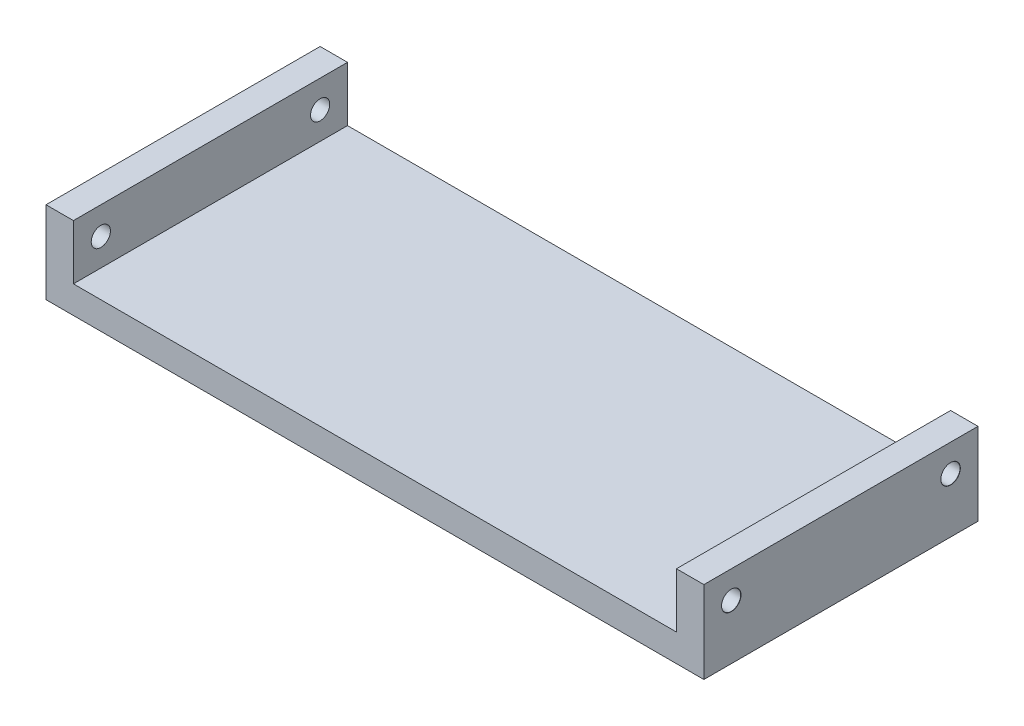
ISO-10303-21;
HEADER;
FILE_DESCRIPTION(('STEP AP214'),'2;1');
FILE_NAME('part.step','',(''),(''),'','','');
FILE_SCHEMA(('AUTOMOTIVE_DESIGN { 1 0 10303 214 1 1 1 1 }'));
ENDSEC;
DATA;
#1=APPLICATION_CONTEXT('core data for automotive mechanical design processes');
#2=APPLICATION_PROTOCOL_DEFINITION('international standard','automotive_design',2000,#1);
#3=PRODUCT_CONTEXT('',#1,'mechanical');
#4=PRODUCT('Part','Part','',(#3));
#5=PRODUCT_RELATED_PRODUCT_CATEGORY('part','',(#4));
#6=PRODUCT_DEFINITION_FORMATION('','',#4);
#7=PRODUCT_DEFINITION_CONTEXT('part definition',#1,'design');
#8=PRODUCT_DEFINITION('design','',#6,#7);
#9=PRODUCT_DEFINITION_SHAPE('','',#8);
#10=(LENGTH_UNIT() NAMED_UNIT(*) SI_UNIT(.MILLI.,.METRE.));
#11=(NAMED_UNIT(*) PLANE_ANGLE_UNIT() SI_UNIT($,.RADIAN.));
#12=(NAMED_UNIT(*) SI_UNIT($,.STERADIAN.) SOLID_ANGLE_UNIT());
#13=UNCERTAINTY_MEASURE_WITH_UNIT(LENGTH_MEASURE(1.E-05),#10,'distance_accuracy_value','');
#14=(GEOMETRIC_REPRESENTATION_CONTEXT(3) GLOBAL_UNCERTAINTY_ASSIGNED_CONTEXT((#13)) GLOBAL_UNIT_ASSIGNED_CONTEXT((#10,
#11,#12)) REPRESENTATION_CONTEXT('',''));
#15=CARTESIAN_POINT('',(0.,0.,0.));
#16=DIRECTION('',(0.,0.,1.));
#17=DIRECTION('',(1.,0.,0.));
#18=AXIS2_PLACEMENT_3D('',#15,#16,#17);
#19=CARTESIAN_POINT('',(-60.,5.,25.));
#20=DIRECTION('',(1.,0.,0.));
#21=DIRECTION('',(0.,0.,-1.));
#22=AXIS2_PLACEMENT_3D('',#19,#20,#21);
#23=PLANE('',#22);
#24=CARTESIAN_POINT('',(-60.,10.,20.));
#25=DIRECTION('',(1.,0.,0.));
#26=DIRECTION('',(0.,0.,-1.));
#27=AXIS2_PLACEMENT_3D('',#24,#25,#26);
#28=CIRCLE('',#27,1.74999999999999);
#29=CARTESIAN_POINT('',(-60.,10.,18.25));
#30=VERTEX_POINT('',#29);
#31=EDGE_CURVE('E225',#30,#30,#28,.T.);
#32=ORIENTED_EDGE('',*,*,#31,.T.);
#33=EDGE_LOOP('',(#32));
#34=FACE_BOUND('',#33,.T.);
#35=CARTESIAN_POINT('',(-60.,10.,-20.));
#36=DIRECTION('',(1.,0.,0.));
#37=DIRECTION('',(0.,0.,-1.));
#38=AXIS2_PLACEMENT_3D('',#35,#36,#37);
#39=CIRCLE('',#38,1.74999999999999);
#40=CARTESIAN_POINT('',(-60.,10.,-21.75));
#41=VERTEX_POINT('',#40);
#42=EDGE_CURVE('E203',#41,#41,#39,.T.);
#43=ORIENTED_EDGE('',*,*,#42,.T.);
#44=EDGE_LOOP('',(#43));
#45=FACE_BOUND('',#44,.T.);
#46=DIRECTION('',(0.,0.,1.));
#47=VECTOR('',#46,1.);
#48=CARTESIAN_POINT('',(-60.,0.,25.));
#49=LINE('',#48,#47);
#50=CARTESIAN_POINT('',(-60.,0.,-25.));
#51=VERTEX_POINT('',#50);
#52=CARTESIAN_POINT('',(-60.,0.,25.));
#53=VERTEX_POINT('',#52);
#54=EDGE_CURVE('E116',#51,#53,#49,.T.);
#55=ORIENTED_EDGE('',*,*,#54,.T.);
#56=DIRECTION('',(0.,-1.,0.));
#57=VECTOR('',#56,1.);
#58=CARTESIAN_POINT('',(-60.,5.,25.));
#59=LINE('',#58,#57);
#60=CARTESIAN_POINT('',(-60.,15.,25.));
#61=VERTEX_POINT('',#60);
#62=EDGE_CURVE('E11',#61,#53,#59,.T.);
#63=ORIENTED_EDGE('',*,*,#62,.F.);
#64=DIRECTION('',(0.,0.,1.));
#65=VECTOR('',#64,1.);
#66=CARTESIAN_POINT('',(-60.,15.,-25.));
#67=LINE('',#66,#65);
#68=CARTESIAN_POINT('',(-60.,15.,-25.));
#69=VERTEX_POINT('',#68);
#70=EDGE_CURVE('E114',#69,#61,#67,.T.);
#71=ORIENTED_EDGE('',*,*,#70,.F.);
#72=DIRECTION('',(0.,-1.,0.));
#73=VECTOR('',#72,1.);
#74=CARTESIAN_POINT('',(-60.,5.,-25.));
#75=LINE('',#74,#73);
#76=EDGE_CURVE('E181',#69,#51,#75,.T.);
#77=ORIENTED_EDGE('',*,*,#76,.T.);
#78=EDGE_LOOP('',(#55,#63,#71,#77));
#79=FACE_BOUND('',#78,.T.);
#80=ADVANCED_FACE('F45',(#34,#45,#79),#23,.F.);
#81=CARTESIAN_POINT('',(60.,5.,25.));
#82=DIRECTION('',(0.,0.,-1.));
#83=DIRECTION('',(-1.,0.,0.));
#84=AXIS2_PLACEMENT_3D('',#81,#82,#83);
#85=PLANE('',#84);
#86=DIRECTION('',(1.,0.,0.));
#87=VECTOR('',#86,1.);
#88=CARTESIAN_POINT('',(60.,0.,25.));
#89=LINE('',#88,#87);
#90=CARTESIAN_POINT('',(60.,0.,25.));
#91=VERTEX_POINT('',#90);
#92=EDGE_CURVE('E184',#53,#91,#89,.T.);
#93=ORIENTED_EDGE('',*,*,#92,.T.);
#94=DIRECTION('',(0.,-1.,0.));
#95=VECTOR('',#94,1.);
#96=CARTESIAN_POINT('',(60.,5.,25.));
#97=LINE('',#96,#95);
#98=CARTESIAN_POINT('',(60.,15.,25.));
#99=VERTEX_POINT('',#98);
#100=EDGE_CURVE('E54',#99,#91,#97,.T.);
#101=ORIENTED_EDGE('',*,*,#100,.F.);
#102=DIRECTION('',(1.,0.,0.));
#103=VECTOR('',#102,1.);
#104=CARTESIAN_POINT('',(60.,15.,25.));
#105=LINE('',#104,#103);
#106=CARTESIAN_POINT('',(55.,15.,25.));
#107=VERTEX_POINT('',#106);
#108=EDGE_CURVE('E158',#107,#99,#105,.T.);
#109=ORIENTED_EDGE('',*,*,#108,.F.);
#110=DIRECTION('',(0.,-1.,0.));
#111=VECTOR('',#110,1.);
#112=CARTESIAN_POINT('',(55.,15.,25.));
#113=LINE('',#112,#111);
#114=CARTESIAN_POINT('',(55.,5.,25.));
#115=VERTEX_POINT('',#114);
#116=EDGE_CURVE('E154',#107,#115,#113,.T.);
#117=ORIENTED_EDGE('',*,*,#116,.T.);
#118=DIRECTION('',(1.,0.,0.));
#119=VECTOR('',#118,1.);
#120=CARTESIAN_POINT('',(60.,5.,25.));
#121=LINE('',#120,#119);
#122=CARTESIAN_POINT('',(-55.,5.,25.));
#123=VERTEX_POINT('',#122);
#124=EDGE_CURVE('E174',#123,#115,#121,.T.);
#125=ORIENTED_EDGE('',*,*,#124,.F.);
#126=DIRECTION('',(0.,-1.,0.));
#127=VECTOR('',#126,1.);
#128=CARTESIAN_POINT('',(-55.,15.,25.));
#129=LINE('',#128,#127);
#130=CARTESIAN_POINT('',(-55.,15.,25.));
#131=VERTEX_POINT('',#130);
#132=EDGE_CURVE('E122',#131,#123,#129,.T.);
#133=ORIENTED_EDGE('',*,*,#132,.F.);
#134=DIRECTION('',(1.,0.,0.));
#135=VECTOR('',#134,1.);
#136=CARTESIAN_POINT('',(-60.,15.,25.));
#137=LINE('',#136,#135);
#138=EDGE_CURVE('E119',#61,#131,#137,.T.);
#139=ORIENTED_EDGE('',*,*,#138,.F.);
#140=ORIENTED_EDGE('',*,*,#62,.T.);
#141=EDGE_LOOP('',(#93,#101,#109,#117,#125,#133,#139,#140));
#142=FACE_BOUND('',#141,.T.);
#143=ADVANCED_FACE('F120',(#142),#85,.F.);
#144=CARTESIAN_POINT('',(60.,5.,25.));
#145=DIRECTION('',(-1.,0.,0.));
#146=DIRECTION('',(0.,0.,1.));
#147=AXIS2_PLACEMENT_3D('',#144,#145,#146);
#148=PLANE('',#147);
#149=CARTESIAN_POINT('',(60.,10.,20.));
#150=DIRECTION('',(1.,0.,0.));
#151=DIRECTION('',(0.,0.,-1.));
#152=AXIS2_PLACEMENT_3D('',#149,#150,#151);
#153=CIRCLE('',#152,1.775);
#154=CARTESIAN_POINT('',(60.,10.,18.225));
#155=VERTEX_POINT('',#154);
#156=EDGE_CURVE('E233',#155,#155,#153,.T.);
#157=ORIENTED_EDGE('',*,*,#156,.F.);
#158=EDGE_LOOP('',(#157));
#159=FACE_BOUND('',#158,.T.);
#160=CARTESIAN_POINT('',(60.,10.,-20.));
#161=DIRECTION('',(1.,0.,0.));
#162=DIRECTION('',(0.,0.,-1.));
#163=AXIS2_PLACEMENT_3D('',#160,#161,#162);
#164=CIRCLE('',#163,1.775);
#165=CARTESIAN_POINT('',(60.,10.,-21.775));
#166=VERTEX_POINT('',#165);
#167=EDGE_CURVE('E215',#166,#166,#164,.T.);
#168=ORIENTED_EDGE('',*,*,#167,.F.);
#169=EDGE_LOOP('',(#168));
#170=FACE_BOUND('',#169,.T.);
#171=DIRECTION('',(0.,0.,-1.));
#172=VECTOR('',#171,1.);
#173=CARTESIAN_POINT('',(60.,0.,25.));
#174=LINE('',#173,#172);
#175=CARTESIAN_POINT('',(60.,0.,-25.));
#176=VERTEX_POINT('',#175);
#177=EDGE_CURVE('E187',#91,#176,#174,.T.);
#178=ORIENTED_EDGE('',*,*,#177,.T.);
#179=DIRECTION('',(0.,-1.,0.));
#180=VECTOR('',#179,1.);
#181=CARTESIAN_POINT('',(60.,5.,-25.));
#182=LINE('',#181,#180);
#183=CARTESIAN_POINT('',(60.,15.,-25.));
#184=VERTEX_POINT('',#183);
#185=EDGE_CURVE('E194',#184,#176,#182,.T.);
#186=ORIENTED_EDGE('',*,*,#185,.F.);
#187=DIRECTION('',(0.,0.,-1.));
#188=VECTOR('',#187,1.);
#189=CARTESIAN_POINT('',(60.,15.,-25.));
#190=LINE('',#189,#188);
#191=EDGE_CURVE('E161',#99,#184,#190,.T.);
#192=ORIENTED_EDGE('',*,*,#191,.F.);
#193=ORIENTED_EDGE('',*,*,#100,.T.);
#194=EDGE_LOOP('',(#178,#186,#192,#193));
#195=FACE_BOUND('',#194,.T.);
#196=ADVANCED_FACE('F240',(#159,#170,#195),#148,.F.);
#197=CARTESIAN_POINT('',(60.,5.,-25.));
#198=DIRECTION('',(0.,0.,1.));
#199=DIRECTION('',(1.,0.,0.));
#200=AXIS2_PLACEMENT_3D('',#197,#198,#199);
#201=PLANE('',#200);
#202=DIRECTION('',(-1.,0.,0.));
#203=VECTOR('',#202,1.);
#204=CARTESIAN_POINT('',(60.,0.,-25.));
#205=LINE('',#204,#203);
#206=EDGE_CURVE('E178',#176,#51,#205,.T.);
#207=ORIENTED_EDGE('',*,*,#206,.T.);
#208=ORIENTED_EDGE('',*,*,#76,.F.);
#209=DIRECTION('',(-1.,0.,0.));
#210=VECTOR('',#209,1.);
#211=CARTESIAN_POINT('',(-60.,15.,-25.));
#212=LINE('',#211,#210);
#213=CARTESIAN_POINT('',(-55.,15.,-25.));
#214=VERTEX_POINT('',#213);
#215=EDGE_CURVE('E131',#214,#69,#212,.T.);
#216=ORIENTED_EDGE('',*,*,#215,.F.);
#217=DIRECTION('',(0.,-1.,0.));
#218=VECTOR('',#217,1.);
#219=CARTESIAN_POINT('',(-55.,15.,-25.));
#220=LINE('',#219,#218);
#221=CARTESIAN_POINT('',(-55.,5.,-25.));
#222=VERTEX_POINT('',#221);
#223=EDGE_CURVE('E143',#214,#222,#220,.T.);
#224=ORIENTED_EDGE('',*,*,#223,.T.);
#225=DIRECTION('',(-1.,0.,0.));
#226=VECTOR('',#225,1.);
#227=CARTESIAN_POINT('',(60.,5.,-25.));
#228=LINE('',#227,#226);
#229=CARTESIAN_POINT('',(55.,5.,-25.));
#230=VERTEX_POINT('',#229);
#231=EDGE_CURVE('E177',#230,#222,#228,.T.);
#232=ORIENTED_EDGE('',*,*,#231,.F.);
#233=DIRECTION('',(0.,-1.,0.));
#234=VECTOR('',#233,1.);
#235=CARTESIAN_POINT('',(55.,15.,-25.));
#236=LINE('',#235,#234);
#237=CARTESIAN_POINT('',(55.,15.,-25.));
#238=VERTEX_POINT('',#237);
#239=EDGE_CURVE('E150',#238,#230,#236,.T.);
#240=ORIENTED_EDGE('',*,*,#239,.F.);
#241=DIRECTION('',(-1.,0.,0.));
#242=VECTOR('',#241,1.);
#243=CARTESIAN_POINT('',(60.,15.,-25.));
#244=LINE('',#243,#242);
#245=EDGE_CURVE('E168',#184,#238,#244,.T.);
#246=ORIENTED_EDGE('',*,*,#245,.F.);
#247=ORIENTED_EDGE('',*,*,#185,.T.);
#248=EDGE_LOOP('',(#207,#208,#216,#224,#232,#240,#246,#247));
#249=FACE_BOUND('',#248,.T.);
#250=ADVANCED_FACE('F243',(#249),#201,.F.);
#251=CARTESIAN_POINT('',(0.,5.,0.));
#252=DIRECTION('',(0.,1.,0.));
#253=DIRECTION('',(0.,0.,1.));
#254=AXIS2_PLACEMENT_3D('',#251,#252,#253);
#255=PLANE('',#254);
#256=DIRECTION('',(0.,0.,-1.));
#257=VECTOR('',#256,1.);
#258=CARTESIAN_POINT('',(-55.,5.,-25.));
#259=LINE('',#258,#257);
#260=EDGE_CURVE('E67',#123,#222,#259,.T.);
#261=ORIENTED_EDGE('',*,*,#260,.F.);
#262=ORIENTED_EDGE('',*,*,#124,.T.);
#263=DIRECTION('',(0.,0.,1.));
#264=VECTOR('',#263,1.);
#265=CARTESIAN_POINT('',(55.,5.,-25.));
#266=LINE('',#265,#264);
#267=EDGE_CURVE('E62',#230,#115,#266,.T.);
#268=ORIENTED_EDGE('',*,*,#267,.F.);
#269=ORIENTED_EDGE('',*,*,#231,.T.);
#270=EDGE_LOOP('',(#261,#262,#268,#269));
#271=FACE_BOUND('',#270,.T.);
#272=ADVANCED_FACE('F265',(#271),#255,.T.);
#273=CARTESIAN_POINT('',(0.,0.,0.));
#274=DIRECTION('',(0.,1.,0.));
#275=DIRECTION('',(0.,0.,1.));
#276=AXIS2_PLACEMENT_3D('',#273,#274,#275);
#277=PLANE('',#276);
#278=ORIENTED_EDGE('',*,*,#54,.F.);
#279=ORIENTED_EDGE('',*,*,#206,.F.);
#280=ORIENTED_EDGE('',*,*,#177,.F.);
#281=ORIENTED_EDGE('',*,*,#92,.F.);
#282=EDGE_LOOP('',(#278,#279,#280,#281));
#283=FACE_BOUND('',#282,.T.);
#284=ADVANCED_FACE('F254',(#283),#277,.F.);
#285=CARTESIAN_POINT('',(55.,15.,-25.));
#286=DIRECTION('',(1.,0.,0.));
#287=DIRECTION('',(0.,0.,-1.));
#288=AXIS2_PLACEMENT_3D('',#285,#286,#287);
#289=PLANE('',#288);
#290=CARTESIAN_POINT('',(55.,10.,20.));
#291=DIRECTION('',(1.,0.,0.));
#292=DIRECTION('',(0.,0.,-1.));
#293=AXIS2_PLACEMENT_3D('',#290,#291,#292);
#294=CIRCLE('',#293,1.74999999999999);
#295=CARTESIAN_POINT('',(55.,10.,18.25));
#296=VERTEX_POINT('',#295);
#297=EDGE_CURVE('E221',#296,#296,#294,.T.);
#298=ORIENTED_EDGE('',*,*,#297,.T.);
#299=EDGE_LOOP('',(#298));
#300=FACE_BOUND('',#299,.T.);
#301=CARTESIAN_POINT('',(55.,10.,-20.));
#302=DIRECTION('',(1.,0.,0.));
#303=DIRECTION('',(0.,0.,-1.));
#304=AXIS2_PLACEMENT_3D('',#301,#302,#303);
#305=CIRCLE('',#304,1.74999999999999);
#306=CARTESIAN_POINT('',(55.,10.,-21.75));
#307=VERTEX_POINT('',#306);
#308=EDGE_CURVE('E137',#307,#307,#305,.T.);
#309=ORIENTED_EDGE('',*,*,#308,.T.);
#310=EDGE_LOOP('',(#309));
#311=FACE_BOUND('',#310,.T.);
#312=ORIENTED_EDGE('',*,*,#267,.T.);
#313=ORIENTED_EDGE('',*,*,#116,.F.);
#314=DIRECTION('',(0.,0.,1.));
#315=VECTOR('',#314,1.);
#316=CARTESIAN_POINT('',(55.,15.,-25.));
#317=LINE('',#316,#315);
#318=EDGE_CURVE('E165',#238,#107,#317,.T.);
#319=ORIENTED_EDGE('',*,*,#318,.F.);
#320=ORIENTED_EDGE('',*,*,#239,.T.);
#321=EDGE_LOOP('',(#312,#313,#319,#320));
#322=FACE_BOUND('',#321,.T.);
#323=ADVANCED_FACE('F261',(#300,#311,#322),#289,.F.);
#324=CARTESIAN_POINT('',(0.,15.,0.));
#325=DIRECTION('',(0.,-1.,0.));
#326=DIRECTION('',(0.,0.,-1.));
#327=AXIS2_PLACEMENT_3D('',#324,#325,#326);
#328=PLANE('',#327);
#329=ORIENTED_EDGE('',*,*,#191,.T.);
#330=ORIENTED_EDGE('',*,*,#245,.T.);
#331=ORIENTED_EDGE('',*,*,#318,.T.);
#332=ORIENTED_EDGE('',*,*,#108,.T.);
#333=EDGE_LOOP('',(#329,#330,#331,#332));
#334=FACE_BOUND('',#333,.T.);
#335=ADVANCED_FACE('F257',(#334),#328,.F.);
#336=CARTESIAN_POINT('',(-55.,15.,-25.));
#337=DIRECTION('',(-1.,0.,0.));
#338=DIRECTION('',(0.,0.,1.));
#339=AXIS2_PLACEMENT_3D('',#336,#337,#338);
#340=PLANE('',#339);
#341=CARTESIAN_POINT('',(-55.,10.,20.));
#342=DIRECTION('',(-1.,0.,0.));
#343=DIRECTION('',(0.,0.,1.));
#344=AXIS2_PLACEMENT_3D('',#341,#342,#343);
#345=CIRCLE('',#344,1.74999999999999);
#346=CARTESIAN_POINT('',(-55.,10.,21.75));
#347=VERTEX_POINT('',#346);
#348=EDGE_CURVE('E48',#347,#347,#345,.T.);
#349=ORIENTED_EDGE('',*,*,#348,.T.);
#350=EDGE_LOOP('',(#349));
#351=FACE_BOUND('',#350,.T.);
#352=CARTESIAN_POINT('',(-55.,10.,-20.));
#353=DIRECTION('',(-1.,0.,0.));
#354=DIRECTION('',(0.,0.,1.));
#355=AXIS2_PLACEMENT_3D('',#352,#353,#354);
#356=CIRCLE('',#355,1.74999999999999);
#357=CARTESIAN_POINT('',(-55.,10.,-18.25));
#358=VERTEX_POINT('',#357);
#359=EDGE_CURVE('E200',#358,#358,#356,.T.);
#360=ORIENTED_EDGE('',*,*,#359,.T.);
#361=EDGE_LOOP('',(#360));
#362=FACE_BOUND('',#361,.T.);
#363=ORIENTED_EDGE('',*,*,#260,.T.);
#364=ORIENTED_EDGE('',*,*,#223,.F.);
#365=DIRECTION('',(0.,0.,-1.));
#366=VECTOR('',#365,1.);
#367=CARTESIAN_POINT('',(-55.,15.,-25.));
#368=LINE('',#367,#366);
#369=EDGE_CURVE('E126',#131,#214,#368,.T.);
#370=ORIENTED_EDGE('',*,*,#369,.F.);
#371=ORIENTED_EDGE('',*,*,#132,.T.);
#372=EDGE_LOOP('',(#363,#364,#370,#371));
#373=FACE_BOUND('',#372,.T.);
#374=ADVANCED_FACE('F263',(#351,#362,#373),#340,.F.);
#375=CARTESIAN_POINT('',(0.,15.,0.));
#376=DIRECTION('',(0.,1.,0.));
#377=DIRECTION('',(0.,0.,1.));
#378=AXIS2_PLACEMENT_3D('',#375,#376,#377);
#379=PLANE('',#378);
#380=ORIENTED_EDGE('',*,*,#70,.T.);
#381=ORIENTED_EDGE('',*,*,#138,.T.);
#382=ORIENTED_EDGE('',*,*,#369,.T.);
#383=ORIENTED_EDGE('',*,*,#215,.T.);
#384=EDGE_LOOP('',(#380,#381,#382,#383));
#385=FACE_BOUND('',#384,.T.);
#386=ADVANCED_FACE('F129',(#385),#379,.T.);
#387=CARTESIAN_POINT('',(60.,10.,-20.));
#388=DIRECTION('',(1.,0.,0.));
#389=DIRECTION('',(0.,0.,-1.));
#390=AXIS2_PLACEMENT_3D('',#387,#388,#389);
#391=CYLINDRICAL_SURFACE('',#390,1.74999999999999);
#392=ORIENTED_EDGE('',*,*,#42,.F.);
#393=EDGE_LOOP('',(#392));
#394=FACE_BOUND('',#393,.T.);
#395=ORIENTED_EDGE('',*,*,#359,.F.);
#396=EDGE_LOOP('',(#395));
#397=FACE_BOUND('',#396,.T.);
#398=ADVANCED_FACE('F300',(#394,#397),#391,.F.);
#399=CARTESIAN_POINT('',(59.975,10.,-20.));
#400=DIRECTION('',(1.,0.,0.));
#401=DIRECTION('',(0.,0.,-1.));
#402=AXIS2_PLACEMENT_3D('',#399,#400,#401);
#403=CIRCLE('',#402,1.75);
#404=CARTESIAN_POINT('',(59.975,10.,-21.75));
#405=VERTEX_POINT('',#404);
#406=EDGE_CURVE('E210',#405,#405,#403,.T.);
#407=ORIENTED_EDGE('',*,*,#406,.T.);
#408=EDGE_LOOP('',(#407));
#409=FACE_BOUND('',#408,.T.);
#410=ORIENTED_EDGE('',*,*,#308,.F.);
#411=EDGE_LOOP('',(#410));
#412=FACE_BOUND('',#411,.T.);
#413=ADVANCED_FACE('F311',(#409,#412),#391,.F.);
#414=CARTESIAN_POINT('',(60.,10.,-20.));
#415=DIRECTION('',(1.,0.,0.));
#416=DIRECTION('',(0.,0.,-1.));
#417=AXIS2_PLACEMENT_3D('',#414,#415,#416);
#418=CONICAL_SURFACE('',#417,1.775,0.785398163397518);
#419=ORIENTED_EDGE('',*,*,#406,.F.);
#420=EDGE_LOOP('',(#419));
#421=FACE_BOUND('',#420,.T.);
#422=ORIENTED_EDGE('',*,*,#167,.T.);
#423=EDGE_LOOP('',(#422));
#424=FACE_BOUND('',#423,.T.);
#425=ADVANCED_FACE('F288',(#421,#424),#418,.F.);
#426=CARTESIAN_POINT('',(60.,10.,20.));
#427=DIRECTION('',(1.,0.,0.));
#428=DIRECTION('',(0.,0.,-1.));
#429=AXIS2_PLACEMENT_3D('',#426,#427,#428);
#430=CYLINDRICAL_SURFACE('',#429,1.74999999999999);
#431=ORIENTED_EDGE('',*,*,#31,.F.);
#432=EDGE_LOOP('',(#431));
#433=FACE_BOUND('',#432,.T.);
#434=ORIENTED_EDGE('',*,*,#348,.F.);
#435=EDGE_LOOP('',(#434));
#436=FACE_BOUND('',#435,.T.);
#437=ADVANCED_FACE('F284',(#433,#436),#430,.F.);
#438=CARTESIAN_POINT('',(59.975,10.,20.));
#439=DIRECTION('',(1.,0.,0.));
#440=DIRECTION('',(0.,0.,-1.));
#441=AXIS2_PLACEMENT_3D('',#438,#439,#440);
#442=CIRCLE('',#441,1.75);
#443=CARTESIAN_POINT('',(59.975,10.,18.25));
#444=VERTEX_POINT('',#443);
#445=EDGE_CURVE('E229',#444,#444,#442,.T.);
#446=ORIENTED_EDGE('',*,*,#445,.T.);
#447=EDGE_LOOP('',(#446));
#448=FACE_BOUND('',#447,.T.);
#449=ORIENTED_EDGE('',*,*,#297,.F.);
#450=EDGE_LOOP('',(#449));
#451=FACE_BOUND('',#450,.T.);
#452=ADVANCED_FACE('F287',(#448,#451),#430,.F.);
#453=CARTESIAN_POINT('',(60.,10.,20.));
#454=DIRECTION('',(1.,0.,0.));
#455=DIRECTION('',(0.,0.,-1.));
#456=AXIS2_PLACEMENT_3D('',#453,#454,#455);
#457=CONICAL_SURFACE('',#456,1.775,0.785398163397518);
#458=ORIENTED_EDGE('',*,*,#445,.F.);
#459=EDGE_LOOP('',(#458));
#460=FACE_BOUND('',#459,.T.);
#461=ORIENTED_EDGE('',*,*,#156,.T.);
#462=EDGE_LOOP('',(#461));
#463=FACE_BOUND('',#462,.T.);
#464=ADVANCED_FACE('F238',(#460,#463),#457,.F.);
#465=CLOSED_SHELL('',(#80,#143,#196,#250,#272,#284,#323,#335,#374,#386,#398,#413,#425,#437,#452,#464));
#466=MANIFOLD_SOLID_BREP('B2',#465);
#467=ADVANCED_BREP_SHAPE_REPRESENTATION('',(#18,#466),#14);
#468=SHAPE_DEFINITION_REPRESENTATION(#9,#467);
ENDSEC;
END-ISO-10303-21;
